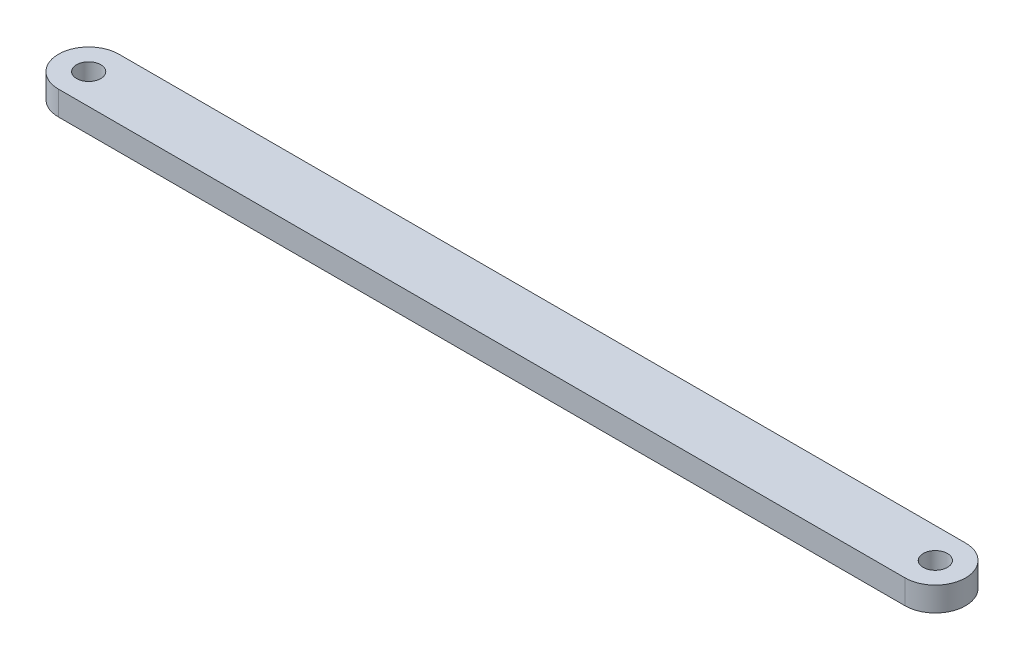
ISO-10303-21;
HEADER;
FILE_DESCRIPTION(('STEP AP214'),'2;1');
FILE_NAME('part.step','',(''),(''),'','','');
FILE_SCHEMA(('AUTOMOTIVE_DESIGN { 1 0 10303 214 1 1 1 1 }'));
ENDSEC;
DATA;
#1=APPLICATION_CONTEXT('core data for automotive mechanical design processes');
#2=APPLICATION_PROTOCOL_DEFINITION('international standard','automotive_design',2000,#1);
#3=PRODUCT_CONTEXT('',#1,'mechanical');
#4=PRODUCT('Part','Part','',(#3));
#5=PRODUCT_RELATED_PRODUCT_CATEGORY('part','',(#4));
#6=PRODUCT_DEFINITION_FORMATION('','',#4);
#7=PRODUCT_DEFINITION_CONTEXT('part definition',#1,'design');
#8=PRODUCT_DEFINITION('design','',#6,#7);
#9=PRODUCT_DEFINITION_SHAPE('','',#8);
#10=(LENGTH_UNIT() NAMED_UNIT(*) SI_UNIT(.MILLI.,.METRE.));
#11=(NAMED_UNIT(*) PLANE_ANGLE_UNIT() SI_UNIT($,.RADIAN.));
#12=(NAMED_UNIT(*) SI_UNIT($,.STERADIAN.) SOLID_ANGLE_UNIT());
#13=UNCERTAINTY_MEASURE_WITH_UNIT(LENGTH_MEASURE(1.E-05),#10,'distance_accuracy_value','');
#14=(GEOMETRIC_REPRESENTATION_CONTEXT(3) GLOBAL_UNCERTAINTY_ASSIGNED_CONTEXT((#13)) GLOBAL_UNIT_ASSIGNED_CONTEXT((#10,
#11,#12)) REPRESENTATION_CONTEXT('',''));
#15=CARTESIAN_POINT('',(0.,0.,0.));
#16=DIRECTION('',(0.,0.,1.));
#17=DIRECTION('',(1.,0.,0.));
#18=AXIS2_PLACEMENT_3D('',#15,#16,#17);
#19=CARTESIAN_POINT('',(-10.,2.,0.));
#20=DIRECTION('',(0.,1.,0.));
#21=DIRECTION('',(0.,0.,1.));
#22=AXIS2_PLACEMENT_3D('',#19,#20,#21);
#23=PLANE('',#22);
#24=CARTESIAN_POINT('',(60.,2.,0.));
#25=DIRECTION('',(0.,1.,0.));
#26=DIRECTION('',(0.,0.,1.));
#27=AXIS2_PLACEMENT_3D('',#24,#25,#26);
#28=CIRCLE('',#27,0.999999999999998);
#29=CARTESIAN_POINT('',(60.,2.,0.999999999999998));
#30=VERTEX_POINT('',#29);
#31=EDGE_CURVE('E103',#30,#30,#28,.T.);
#32=ORIENTED_EDGE('',*,*,#31,.F.);
#33=EDGE_LOOP('',(#32));
#34=FACE_BOUND('',#33,.T.);
#35=CARTESIAN_POINT('',(-10.,2.,0.));
#36=DIRECTION('',(0.,1.,0.));
#37=DIRECTION('',(0.,0.,1.));
#38=AXIS2_PLACEMENT_3D('',#35,#36,#37);
#39=CIRCLE('',#38,2.5);
#40=CARTESIAN_POINT('',(-10.,2.,-2.5));
#41=VERTEX_POINT('',#40);
#42=CARTESIAN_POINT('',(-10.,2.,2.5));
#43=VERTEX_POINT('',#42);
#44=EDGE_CURVE('E88',#41,#43,#39,.T.);
#45=ORIENTED_EDGE('',*,*,#44,.T.);
#46=DIRECTION('',(1.,0.,0.));
#47=VECTOR('',#46,1.);
#48=CARTESIAN_POINT('',(-10.,2.,2.5));
#49=LINE('',#48,#47);
#50=CARTESIAN_POINT('',(60.,2.,2.5));
#51=VERTEX_POINT('',#50);
#52=EDGE_CURVE('E83',#43,#51,#49,.T.);
#53=ORIENTED_EDGE('',*,*,#52,.T.);
#54=CARTESIAN_POINT('',(60.,2.,0.));
#55=DIRECTION('',(0.,1.,0.));
#56=DIRECTION('',(0.,0.,1.));
#57=AXIS2_PLACEMENT_3D('',#54,#55,#56);
#58=CIRCLE('',#57,2.5);
#59=CARTESIAN_POINT('',(60.,2.,-2.5));
#60=VERTEX_POINT('',#59);
#61=EDGE_CURVE('E86',#51,#60,#58,.T.);
#62=ORIENTED_EDGE('',*,*,#61,.T.);
#63=DIRECTION('',(-1.,0.,0.));
#64=VECTOR('',#63,1.);
#65=CARTESIAN_POINT('',(-10.,2.,-2.5));
#66=LINE('',#65,#64);
#67=EDGE_CURVE('E53',#60,#41,#66,.T.);
#68=ORIENTED_EDGE('',*,*,#67,.T.);
#69=EDGE_LOOP('',(#45,#53,#62,#68));
#70=FACE_BOUND('',#69,.T.);
#71=CARTESIAN_POINT('',(-10.,2.,0.));
#72=DIRECTION('',(0.,1.,0.));
#73=DIRECTION('',(0.,0.,1.));
#74=AXIS2_PLACEMENT_3D('',#71,#72,#73);
#75=CIRCLE('',#74,1.);
#76=CARTESIAN_POINT('',(-10.,2.,1.));
#77=VERTEX_POINT('',#76);
#78=EDGE_CURVE('E118',#77,#77,#75,.T.);
#79=ORIENTED_EDGE('',*,*,#78,.F.);
#80=EDGE_LOOP('',(#79));
#81=FACE_BOUND('',#80,.T.);
#82=ADVANCED_FACE('F36',(#34,#70,#81),#23,.T.);
#83=CARTESIAN_POINT('',(-10.,0.,0.));
#84=DIRECTION('',(0.,1.,0.));
#85=DIRECTION('',(0.,0.,1.));
#86=AXIS2_PLACEMENT_3D('',#83,#84,#85);
#87=PLANE('',#86);
#88=CARTESIAN_POINT('',(-10.,0.,0.));
#89=DIRECTION('',(0.,1.,0.));
#90=DIRECTION('',(0.,0.,1.));
#91=AXIS2_PLACEMENT_3D('',#88,#89,#90);
#92=CIRCLE('',#91,2.5);
#93=CARTESIAN_POINT('',(-10.,0.,-2.5));
#94=VERTEX_POINT('',#93);
#95=CARTESIAN_POINT('',(-10.,0.,2.5));
#96=VERTEX_POINT('',#95);
#97=EDGE_CURVE('E100',#94,#96,#92,.T.);
#98=ORIENTED_EDGE('',*,*,#97,.F.);
#99=DIRECTION('',(-1.,0.,0.));
#100=VECTOR('',#99,1.);
#101=CARTESIAN_POINT('',(-10.,0.,-2.5));
#102=LINE('',#101,#100);
#103=CARTESIAN_POINT('',(60.,0.,-2.5));
#104=VERTEX_POINT('',#103);
#105=EDGE_CURVE('E76',#104,#94,#102,.T.);
#106=ORIENTED_EDGE('',*,*,#105,.F.);
#107=CARTESIAN_POINT('',(60.,0.,0.));
#108=DIRECTION('',(0.,1.,0.));
#109=DIRECTION('',(0.,0.,1.));
#110=AXIS2_PLACEMENT_3D('',#107,#108,#109);
#111=CIRCLE('',#110,2.5);
#112=CARTESIAN_POINT('',(60.,0.,2.5));
#113=VERTEX_POINT('',#112);
#114=EDGE_CURVE('E70',#113,#104,#111,.T.);
#115=ORIENTED_EDGE('',*,*,#114,.F.);
#116=DIRECTION('',(1.,0.,0.));
#117=VECTOR('',#116,1.);
#118=CARTESIAN_POINT('',(-10.,0.,2.5));
#119=LINE('',#118,#117);
#120=EDGE_CURVE('E92',#96,#113,#119,.T.);
#121=ORIENTED_EDGE('',*,*,#120,.F.);
#122=EDGE_LOOP('',(#98,#106,#115,#121));
#123=FACE_BOUND('',#122,.T.);
#124=CARTESIAN_POINT('',(60.,0.,0.));
#125=DIRECTION('',(0.,1.,0.));
#126=DIRECTION('',(0.,0.,1.));
#127=AXIS2_PLACEMENT_3D('',#124,#125,#126);
#128=CIRCLE('',#127,0.999999999999998);
#129=CARTESIAN_POINT('',(60.,0.,0.999999999999998));
#130=VERTEX_POINT('',#129);
#131=EDGE_CURVE('E115',#130,#130,#128,.T.);
#132=ORIENTED_EDGE('',*,*,#131,.T.);
#133=EDGE_LOOP('',(#132));
#134=FACE_BOUND('',#133,.T.);
#135=CARTESIAN_POINT('',(-10.,0.,0.));
#136=DIRECTION('',(0.,1.,0.));
#137=DIRECTION('',(0.,0.,1.));
#138=AXIS2_PLACEMENT_3D('',#135,#136,#137);
#139=CIRCLE('',#138,1.);
#140=CARTESIAN_POINT('',(-10.,0.,1.));
#141=VERTEX_POINT('',#140);
#142=EDGE_CURVE('E121',#141,#141,#139,.T.);
#143=ORIENTED_EDGE('',*,*,#142,.T.);
#144=EDGE_LOOP('',(#143));
#145=FACE_BOUND('',#144,.T.);
#146=ADVANCED_FACE('F111',(#123,#134,#145),#87,.F.);
#147=CARTESIAN_POINT('',(-10.,2.,0.));
#148=DIRECTION('',(0.,-1.,0.));
#149=DIRECTION('',(0.,0.,-1.));
#150=AXIS2_PLACEMENT_3D('',#147,#148,#149);
#151=CYLINDRICAL_SURFACE('',#150,2.5);
#152=ORIENTED_EDGE('',*,*,#97,.T.);
#153=DIRECTION('',(0.,-1.,0.));
#154=VECTOR('',#153,1.);
#155=CARTESIAN_POINT('',(-10.,2.,2.5));
#156=LINE('',#155,#154);
#157=EDGE_CURVE('E11',#43,#96,#156,.T.);
#158=ORIENTED_EDGE('',*,*,#157,.F.);
#159=ORIENTED_EDGE('',*,*,#44,.F.);
#160=DIRECTION('',(0.,-1.,0.));
#161=VECTOR('',#160,1.);
#162=CARTESIAN_POINT('',(-10.,2.,-2.5));
#163=LINE('',#162,#161);
#164=EDGE_CURVE('E96',#41,#94,#163,.T.);
#165=ORIENTED_EDGE('',*,*,#164,.T.);
#166=EDGE_LOOP('',(#152,#158,#159,#165));
#167=FACE_BOUND('',#166,.T.);
#168=ADVANCED_FACE('F38',(#167),#151,.T.);
#169=CARTESIAN_POINT('',(-10.,2.,2.5));
#170=DIRECTION('',(0.,0.,-1.));
#171=DIRECTION('',(-1.,0.,0.));
#172=AXIS2_PLACEMENT_3D('',#169,#170,#171);
#173=PLANE('',#172);
#174=ORIENTED_EDGE('',*,*,#120,.T.);
#175=DIRECTION('',(0.,-1.,0.));
#176=VECTOR('',#175,1.);
#177=CARTESIAN_POINT('',(60.,2.,2.5));
#178=LINE('',#177,#176);
#179=EDGE_CURVE('E45',#51,#113,#178,.T.);
#180=ORIENTED_EDGE('',*,*,#179,.F.);
#181=ORIENTED_EDGE('',*,*,#52,.F.);
#182=ORIENTED_EDGE('',*,*,#157,.T.);
#183=EDGE_LOOP('',(#174,#180,#181,#182));
#184=FACE_BOUND('',#183,.T.);
#185=ADVANCED_FACE('F91',(#184),#173,.F.);
#186=CARTESIAN_POINT('',(60.,2.,0.));
#187=DIRECTION('',(0.,-1.,0.));
#188=DIRECTION('',(0.,0.,-1.));
#189=AXIS2_PLACEMENT_3D('',#186,#187,#188);
#190=CYLINDRICAL_SURFACE('',#189,2.5);
#191=ORIENTED_EDGE('',*,*,#114,.T.);
#192=DIRECTION('',(0.,-1.,0.));
#193=VECTOR('',#192,1.);
#194=CARTESIAN_POINT('',(60.,2.,-2.5));
#195=LINE('',#194,#193);
#196=EDGE_CURVE('E93',#60,#104,#195,.T.);
#197=ORIENTED_EDGE('',*,*,#196,.F.);
#198=ORIENTED_EDGE('',*,*,#61,.F.);
#199=ORIENTED_EDGE('',*,*,#179,.T.);
#200=EDGE_LOOP('',(#191,#197,#198,#199));
#201=FACE_BOUND('',#200,.T.);
#202=ADVANCED_FACE('F94',(#201),#190,.T.);
#203=CARTESIAN_POINT('',(-10.,2.,-2.5));
#204=DIRECTION('',(0.,0.,1.));
#205=DIRECTION('',(1.,0.,0.));
#206=AXIS2_PLACEMENT_3D('',#203,#204,#205);
#207=PLANE('',#206);
#208=ORIENTED_EDGE('',*,*,#105,.T.);
#209=ORIENTED_EDGE('',*,*,#164,.F.);
#210=ORIENTED_EDGE('',*,*,#67,.F.);
#211=ORIENTED_EDGE('',*,*,#196,.T.);
#212=EDGE_LOOP('',(#208,#209,#210,#211));
#213=FACE_BOUND('',#212,.T.);
#214=ADVANCED_FACE('F108',(#213),#207,.F.);
#215=CARTESIAN_POINT('',(60.,2.,0.));
#216=DIRECTION('',(0.,-1.,0.));
#217=DIRECTION('',(0.,0.,-1.));
#218=AXIS2_PLACEMENT_3D('',#215,#216,#217);
#219=CYLINDRICAL_SURFACE('',#218,0.999999999999998);
#220=ORIENTED_EDGE('',*,*,#31,.T.);
#221=EDGE_LOOP('',(#220));
#222=FACE_BOUND('',#221,.T.);
#223=ORIENTED_EDGE('',*,*,#131,.F.);
#224=EDGE_LOOP('',(#223));
#225=FACE_BOUND('',#224,.T.);
#226=ADVANCED_FACE('F138',(#222,#225),#219,.F.);
#227=CARTESIAN_POINT('',(-10.,2.,0.));
#228=DIRECTION('',(0.,-1.,0.));
#229=DIRECTION('',(0.,0.,-1.));
#230=AXIS2_PLACEMENT_3D('',#227,#228,#229);
#231=CYLINDRICAL_SURFACE('',#230,1.);
#232=ORIENTED_EDGE('',*,*,#78,.T.);
#233=EDGE_LOOP('',(#232));
#234=FACE_BOUND('',#233,.T.);
#235=ORIENTED_EDGE('',*,*,#142,.F.);
#236=EDGE_LOOP('',(#235));
#237=FACE_BOUND('',#236,.T.);
#238=ADVANCED_FACE('F127',(#234,#237),#231,.F.);
#239=CLOSED_SHELL('',(#82,#146,#168,#185,#202,#214,#226,#238));
#240=MANIFOLD_SOLID_BREP('B2',#239);
#241=ADVANCED_BREP_SHAPE_REPRESENTATION('',(#18,#240),#14);
#242=SHAPE_DEFINITION_REPRESENTATION(#9,#241);
ENDSEC;
END-ISO-10303-21;
